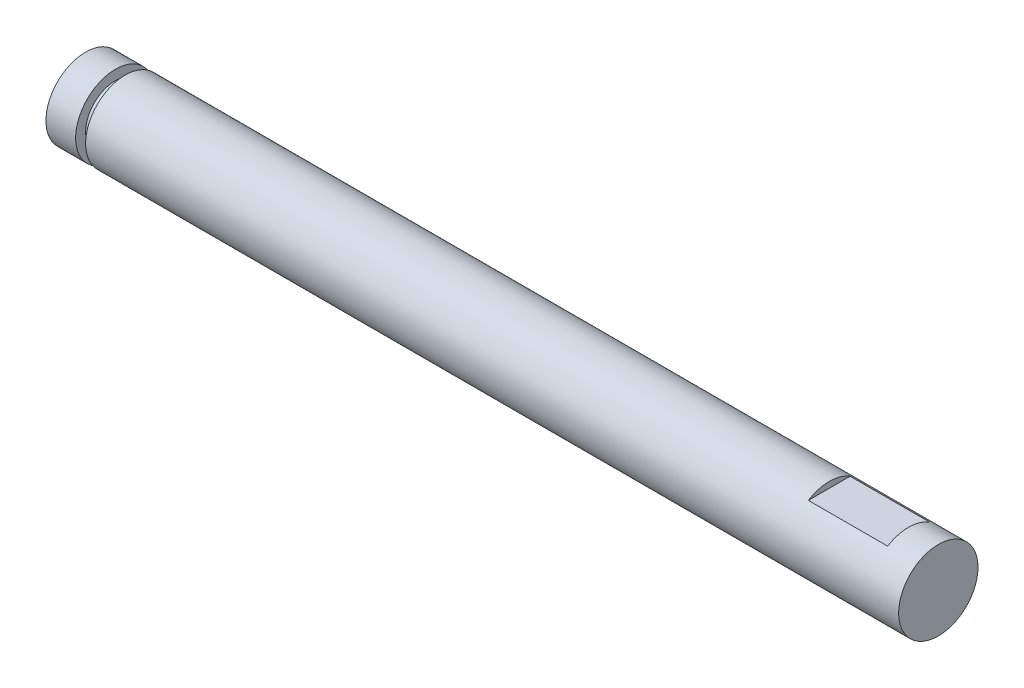
ISO-10303-21;
HEADER;
FILE_DESCRIPTION(('STEP AP214'),'2;1');
FILE_NAME('part.step','',(''),(''),'','','');
FILE_SCHEMA(('AUTOMOTIVE_DESIGN { 1 0 10303 214 1 1 1 1 }'));
ENDSEC;
DATA;
#1=APPLICATION_CONTEXT('core data for automotive mechanical design processes');
#2=APPLICATION_PROTOCOL_DEFINITION('international standard','automotive_design',2000,#1);
#3=PRODUCT_CONTEXT('',#1,'mechanical');
#4=PRODUCT('Part','Part','',(#3));
#5=PRODUCT_RELATED_PRODUCT_CATEGORY('part','',(#4));
#6=PRODUCT_DEFINITION_FORMATION('','',#4);
#7=PRODUCT_DEFINITION_CONTEXT('part definition',#1,'design');
#8=PRODUCT_DEFINITION('design','',#6,#7);
#9=PRODUCT_DEFINITION_SHAPE('','',#8);
#10=(LENGTH_UNIT() NAMED_UNIT(*) SI_UNIT(.MILLI.,.METRE.));
#11=(NAMED_UNIT(*) PLANE_ANGLE_UNIT() SI_UNIT($,.RADIAN.));
#12=(NAMED_UNIT(*) SI_UNIT($,.STERADIAN.) SOLID_ANGLE_UNIT());
#13=UNCERTAINTY_MEASURE_WITH_UNIT(LENGTH_MEASURE(1.E-05),#10,'distance_accuracy_value','');
#14=(GEOMETRIC_REPRESENTATION_CONTEXT(3) GLOBAL_UNCERTAINTY_ASSIGNED_CONTEXT((#13)) GLOBAL_UNIT_ASSIGNED_CONTEXT((#10,
#11,#12)) REPRESENTATION_CONTEXT('',''));
#15=CARTESIAN_POINT('',(0.,0.,0.));
#16=DIRECTION('',(0.,0.,1.));
#17=DIRECTION('',(1.,0.,0.));
#18=AXIS2_PLACEMENT_3D('',#15,#16,#17);
#19=CARTESIAN_POINT('',(21.5,0.,0.));
#20=DIRECTION('',(1.,0.,0.));
#21=DIRECTION('',(0.,0.,-1.));
#22=AXIS2_PLACEMENT_3D('',#19,#20,#21);
#23=PLANE('',#22);
#24=CARTESIAN_POINT('',(21.5,0.,0.));
#25=DIRECTION('',(1.,0.,0.));
#26=DIRECTION('',(0.,0.,-1.));
#27=AXIS2_PLACEMENT_3D('',#24,#25,#26);
#28=CIRCLE('',#27,2.);
#29=CARTESIAN_POINT('',(21.5,0.,-2.));
#30=VERTEX_POINT('',#29);
#31=EDGE_CURVE('E86',#30,#30,#28,.T.);
#32=ORIENTED_EDGE('',*,*,#31,.T.);
#33=EDGE_LOOP('',(#32));
#34=FACE_BOUND('',#33,.T.);
#35=ADVANCED_FACE('F32',(#34),#23,.T.);
#36=CARTESIAN_POINT('',(-21.5,0.,0.));
#37=DIRECTION('',(1.,0.,0.));
#38=DIRECTION('',(0.,0.,-1.));
#39=AXIS2_PLACEMENT_3D('',#36,#37,#38);
#40=CYLINDRICAL_SURFACE('',#39,2.);
#41=CARTESIAN_POINT('',(16.,0.,0.));
#42=DIRECTION('',(-1.,0.,0.));
#43=DIRECTION('',(0.,0.,1.));
#44=AXIS2_PLACEMENT_3D('',#41,#42,#43);
#45=CIRCLE('',#44,2.);
#46=CARTESIAN_POINT('',(16.,1.7,-1.05356537528527));
#47=VERTEX_POINT('',#46);
#48=CARTESIAN_POINT('',(16.,1.7,1.05356537528527));
#49=VERTEX_POINT('',#48);
#50=EDGE_CURVE('E58',#47,#49,#45,.F.);
#51=ORIENTED_EDGE('',*,*,#50,.F.);
#52=DIRECTION('',(1.,0.,0.));
#53=VECTOR('',#52,1.);
#54=CARTESIAN_POINT('',(-21.5,1.7,-1.05356537528527));
#55=LINE('',#54,#53);
#56=CARTESIAN_POINT('',(20.,1.7,-1.05356537528527));
#57=VERTEX_POINT('',#56);
#58=EDGE_CURVE('E39',#47,#57,#55,.T.);
#59=ORIENTED_EDGE('',*,*,#58,.T.);
#60=CARTESIAN_POINT('',(20.,0.,0.));
#61=DIRECTION('',(1.,0.,0.));
#62=DIRECTION('',(0.,0.,-1.));
#63=AXIS2_PLACEMENT_3D('',#60,#61,#62);
#64=CIRCLE('',#63,2.);
#65=CARTESIAN_POINT('',(20.,1.7,1.05356537528527));
#66=VERTEX_POINT('',#65);
#67=EDGE_CURVE('E52',#66,#57,#64,.F.);
#68=ORIENTED_EDGE('',*,*,#67,.F.);
#69=DIRECTION('',(1.,0.,0.));
#70=VECTOR('',#69,1.);
#71=CARTESIAN_POINT('',(-21.5,1.7,1.05356537528527));
#72=LINE('',#71,#70);
#73=EDGE_CURVE('E11',#66,#49,#72,.F.);
#74=ORIENTED_EDGE('',*,*,#73,.T.);
#75=EDGE_LOOP('',(#51,#59,#68,#74));
#76=FACE_BOUND('',#75,.T.);
#77=CARTESIAN_POINT('',(-19.5,0.,0.));
#78=DIRECTION('',(1.,0.,0.));
#79=DIRECTION('',(0.,0.,-1.));
#80=AXIS2_PLACEMENT_3D('',#77,#78,#79);
#81=CIRCLE('',#80,2.);
#82=CARTESIAN_POINT('',(-19.5,0.,-2.));
#83=VERTEX_POINT('',#82);
#84=EDGE_CURVE('E83',#83,#83,#81,.T.);
#85=ORIENTED_EDGE('',*,*,#84,.T.);
#86=EDGE_LOOP('',(#85));
#87=FACE_BOUND('',#86,.T.);
#88=ORIENTED_EDGE('',*,*,#31,.F.);
#89=EDGE_LOOP('',(#88));
#90=FACE_BOUND('',#89,.T.);
#91=ADVANCED_FACE('F59',(#76,#87,#90),#40,.T.);
#92=CARTESIAN_POINT('',(-19.5,1.5,0.));
#93=DIRECTION('',(-1.,0.,0.));
#94=DIRECTION('',(0.,0.,1.));
#95=AXIS2_PLACEMENT_3D('',#92,#93,#94);
#96=PLANE('',#95);
#97=CARTESIAN_POINT('',(-19.5,0.,0.));
#98=DIRECTION('',(1.,0.,0.));
#99=DIRECTION('',(0.,0.,-1.));
#100=AXIS2_PLACEMENT_3D('',#97,#98,#99);
#101=CIRCLE('',#100,1.5);
#102=CARTESIAN_POINT('',(-19.5,0.,-1.5));
#103=VERTEX_POINT('',#102);
#104=EDGE_CURVE('E80',#103,#103,#101,.T.);
#105=ORIENTED_EDGE('',*,*,#104,.T.);
#106=EDGE_LOOP('',(#105));
#107=FACE_BOUND('',#106,.T.);
#108=ORIENTED_EDGE('',*,*,#84,.F.);
#109=EDGE_LOOP('',(#108));
#110=FACE_BOUND('',#109,.T.);
#111=ADVANCED_FACE('F105',(#107,#110),#96,.T.);
#112=CARTESIAN_POINT('',(-21.5,0.,0.));
#113=DIRECTION('',(1.,0.,0.));
#114=DIRECTION('',(0.,0.,-1.));
#115=AXIS2_PLACEMENT_3D('',#112,#113,#114);
#116=CYLINDRICAL_SURFACE('',#115,1.5);
#117=CARTESIAN_POINT('',(-20.,0.,0.));
#118=DIRECTION('',(1.,0.,0.));
#119=DIRECTION('',(0.,0.,-1.));
#120=AXIS2_PLACEMENT_3D('',#117,#118,#119);
#121=CIRCLE('',#120,1.5);
#122=CARTESIAN_POINT('',(-20.,0.,-1.5));
#123=VERTEX_POINT('',#122);
#124=EDGE_CURVE('E77',#123,#123,#121,.T.);
#125=ORIENTED_EDGE('',*,*,#124,.T.);
#126=EDGE_LOOP('',(#125));
#127=FACE_BOUND('',#126,.T.);
#128=ORIENTED_EDGE('',*,*,#104,.F.);
#129=EDGE_LOOP('',(#128));
#130=FACE_BOUND('',#129,.T.);
#131=ADVANCED_FACE('F111',(#127,#130),#116,.T.);
#132=CARTESIAN_POINT('',(-20.,2.,0.));
#133=DIRECTION('',(1.,0.,0.));
#134=DIRECTION('',(0.,0.,-1.));
#135=AXIS2_PLACEMENT_3D('',#132,#133,#134);
#136=PLANE('',#135);
#137=CARTESIAN_POINT('',(-20.,0.,0.));
#138=DIRECTION('',(1.,0.,0.));
#139=DIRECTION('',(0.,0.,-1.));
#140=AXIS2_PLACEMENT_3D('',#137,#138,#139);
#141=CIRCLE('',#140,2.);
#142=CARTESIAN_POINT('',(-20.,0.,-2.));
#143=VERTEX_POINT('',#142);
#144=EDGE_CURVE('E74',#143,#143,#141,.T.);
#145=ORIENTED_EDGE('',*,*,#144,.T.);
#146=EDGE_LOOP('',(#145));
#147=FACE_BOUND('',#146,.T.);
#148=ORIENTED_EDGE('',*,*,#124,.F.);
#149=EDGE_LOOP('',(#148));
#150=FACE_BOUND('',#149,.T.);
#151=ADVANCED_FACE('F117',(#147,#150),#136,.T.);
#152=CARTESIAN_POINT('',(-21.5,0.,0.));
#153=DIRECTION('',(1.,0.,0.));
#154=DIRECTION('',(0.,0.,-1.));
#155=AXIS2_PLACEMENT_3D('',#152,#153,#154);
#156=CYLINDRICAL_SURFACE('',#155,2.);
#157=CARTESIAN_POINT('',(-21.5,0.,0.));
#158=DIRECTION('',(1.,0.,0.));
#159=DIRECTION('',(0.,0.,-1.));
#160=AXIS2_PLACEMENT_3D('',#157,#158,#159);
#161=CIRCLE('',#160,2.);
#162=CARTESIAN_POINT('',(-21.5,0.,-2.));
#163=VERTEX_POINT('',#162);
#164=EDGE_CURVE('E69',#163,#163,#161,.T.);
#165=ORIENTED_EDGE('',*,*,#164,.T.);
#166=EDGE_LOOP('',(#165));
#167=FACE_BOUND('',#166,.T.);
#168=ORIENTED_EDGE('',*,*,#144,.F.);
#169=EDGE_LOOP('',(#168));
#170=FACE_BOUND('',#169,.T.);
#171=ADVANCED_FACE('F121',(#167,#170),#156,.T.);
#172=CARTESIAN_POINT('',(-21.5,2.,0.));
#173=DIRECTION('',(-1.,0.,0.));
#174=DIRECTION('',(0.,0.,1.));
#175=AXIS2_PLACEMENT_3D('',#172,#173,#174);
#176=PLANE('',#175);
#177=ORIENTED_EDGE('',*,*,#164,.F.);
#178=EDGE_LOOP('',(#177));
#179=FACE_BOUND('',#178,.T.);
#180=ADVANCED_FACE('F98',(#179),#176,.T.);
#181=CARTESIAN_POINT('',(16.,1.7,-2.));
#182=DIRECTION('',(-1.,0.,0.));
#183=DIRECTION('',(0.,0.,1.));
#184=AXIS2_PLACEMENT_3D('',#181,#182,#183);
#185=PLANE('',#184);
#186=DIRECTION('',(0.,0.,1.));
#187=VECTOR('',#186,1.);
#188=CARTESIAN_POINT('',(16.,1.7,-2.));
#189=LINE('',#188,#187);
#190=EDGE_CURVE('E66',#47,#49,#189,.T.);
#191=ORIENTED_EDGE('',*,*,#190,.F.);
#192=ORIENTED_EDGE('',*,*,#50,.T.);
#193=EDGE_LOOP('',(#191,#192));
#194=FACE_BOUND('',#193,.T.);
#195=ADVANCED_FACE('F67',(#194),#185,.F.);
#196=CARTESIAN_POINT('',(20.,1.7,-2.));
#197=DIRECTION('',(1.,0.,0.));
#198=DIRECTION('',(0.,0.,-1.));
#199=AXIS2_PLACEMENT_3D('',#196,#197,#198);
#200=PLANE('',#199);
#201=DIRECTION('',(0.,0.,-1.));
#202=VECTOR('',#201,1.);
#203=CARTESIAN_POINT('',(20.,1.7,-2.));
#204=LINE('',#203,#202);
#205=EDGE_CURVE('E46',#66,#57,#204,.T.);
#206=ORIENTED_EDGE('',*,*,#205,.F.);
#207=ORIENTED_EDGE('',*,*,#67,.T.);
#208=EDGE_LOOP('',(#206,#207));
#209=FACE_BOUND('',#208,.T.);
#210=ADVANCED_FACE('F90',(#209),#200,.F.);
#211=CARTESIAN_POINT('',(0.,1.7,0.));
#212=DIRECTION('',(0.,1.,0.));
#213=DIRECTION('',(0.,0.,1.));
#214=AXIS2_PLACEMENT_3D('',#211,#212,#213);
#215=PLANE('',#214);
#216=ORIENTED_EDGE('',*,*,#205,.T.);
#217=ORIENTED_EDGE('',*,*,#58,.F.);
#218=ORIENTED_EDGE('',*,*,#190,.T.);
#219=ORIENTED_EDGE('',*,*,#73,.F.);
#220=EDGE_LOOP('',(#216,#217,#218,#219));
#221=FACE_BOUND('',#220,.T.);
#222=ADVANCED_FACE('F65',(#221),#215,.T.);
#223=CLOSED_SHELL('',(#35,#91,#111,#131,#151,#171,#180,#195,#210,#222));
#224=MANIFOLD_SOLID_BREP('B2',#223);
#225=ADVANCED_BREP_SHAPE_REPRESENTATION('',(#18,#224),#14);
#226=SHAPE_DEFINITION_REPRESENTATION(#9,#225);
ENDSEC;
END-ISO-10303-21;
